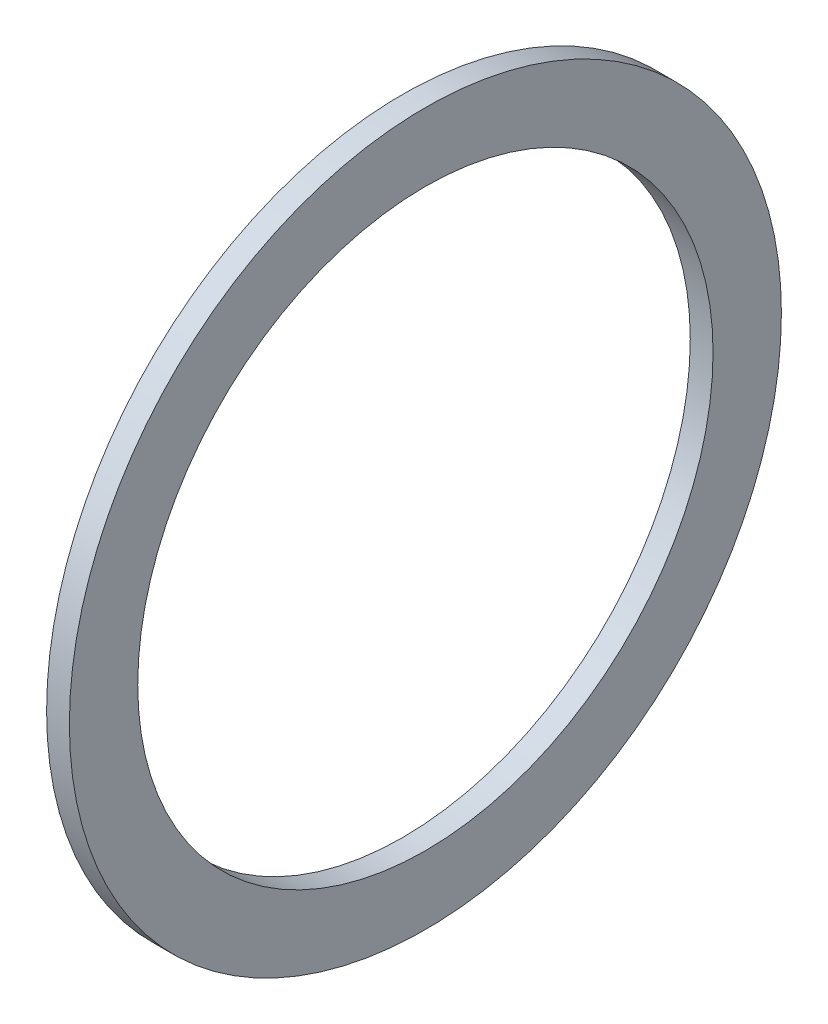
ISO-10303-21;
HEADER;
FILE_DESCRIPTION(('STEP AP214'),'2;1');
FILE_NAME('part.step','',(''),(''),'','','');
FILE_SCHEMA(('AUTOMOTIVE_DESIGN { 1 0 10303 214 1 1 1 1 }'));
ENDSEC;
DATA;
#1=APPLICATION_CONTEXT('core data for automotive mechanical design processes');
#2=APPLICATION_PROTOCOL_DEFINITION('international standard','automotive_design',2000,#1);
#3=PRODUCT_CONTEXT('',#1,'mechanical');
#4=PRODUCT('Part','Part','',(#3));
#5=PRODUCT_RELATED_PRODUCT_CATEGORY('part','',(#4));
#6=PRODUCT_DEFINITION_FORMATION('','',#4);
#7=PRODUCT_DEFINITION_CONTEXT('part definition',#1,'design');
#8=PRODUCT_DEFINITION('design','',#6,#7);
#9=PRODUCT_DEFINITION_SHAPE('','',#8);
#10=(LENGTH_UNIT() NAMED_UNIT(*) SI_UNIT(.MILLI.,.METRE.));
#11=(NAMED_UNIT(*) PLANE_ANGLE_UNIT() SI_UNIT($,.RADIAN.));
#12=(NAMED_UNIT(*) SI_UNIT($,.STERADIAN.) SOLID_ANGLE_UNIT());
#13=UNCERTAINTY_MEASURE_WITH_UNIT(LENGTH_MEASURE(1.E-05),#10,'distance_accuracy_value','');
#14=(GEOMETRIC_REPRESENTATION_CONTEXT(3) GLOBAL_UNCERTAINTY_ASSIGNED_CONTEXT((#13)) GLOBAL_UNIT_ASSIGNED_CONTEXT((#10,
#11,#12)) REPRESENTATION_CONTEXT('',''));
#15=CARTESIAN_POINT('',(0.,0.,0.));
#16=DIRECTION('',(0.,0.,1.));
#17=DIRECTION('',(1.,0.,0.));
#18=AXIS2_PLACEMENT_3D('',#15,#16,#17);
#19=CARTESIAN_POINT('',(16.7,25.003022,-0.005631764349996));
#20=DIRECTION('',(-1.,0.,0.));
#21=DIRECTION('',(0.,0.,1.));
#22=AXIS2_PLACEMENT_3D('',#19,#20,#21);
#23=PLANE('',#22);
#24=CARTESIAN_POINT('',(16.7,12.500022,-12.50863176435));
#25=DIRECTION('',(1.,0.,0.));
#26=DIRECTION('',(0.,0.,-1.));
#27=AXIS2_PLACEMENT_3D('',#24,#25,#26);
#28=CIRCLE('',#27,12.5);
#29=CARTESIAN_POINT('',(16.7,12.500022,-25.00863176435));
#30=VERTEX_POINT('',#29);
#31=EDGE_CURVE('E26',#30,#30,#28,.T.);
#32=ORIENTED_EDGE('',*,*,#31,.F.);
#33=EDGE_LOOP('',(#32));
#34=FACE_BOUND('',#33,.T.);
#35=CARTESIAN_POINT('',(16.7,12.500022,-12.50863176435));
#36=DIRECTION('',(1.,0.,0.));
#37=DIRECTION('',(0.,0.,-1.));
#38=AXIS2_PLACEMENT_3D('',#35,#36,#37);
#39=CIRCLE('',#38,10.1);
#40=CARTESIAN_POINT('',(16.7,12.500022,-22.60863176435));
#41=VERTEX_POINT('',#40);
#42=EDGE_CURVE('E17',#41,#41,#39,.T.);
#43=ORIENTED_EDGE('',*,*,#42,.T.);
#44=EDGE_LOOP('',(#43));
#45=FACE_BOUND('',#44,.T.);
#46=ADVANCED_FACE('F14',(#34,#45),#23,.T.);
#47=CARTESIAN_POINT('',(16.697,12.500022,-12.50863176435));
#48=DIRECTION('',(1.,0.,0.));
#49=DIRECTION('',(0.,0.,-1.));
#50=AXIS2_PLACEMENT_3D('',#47,#48,#49);
#51=CYLINDRICAL_SURFACE('',#50,10.1);
#52=CARTESIAN_POINT('',(17.5,12.500022,-12.50863176435));
#53=DIRECTION('',(1.,0.,0.));
#54=DIRECTION('',(0.,0.,-1.));
#55=AXIS2_PLACEMENT_3D('',#52,#53,#54);
#56=CIRCLE('',#55,10.1);
#57=CARTESIAN_POINT('',(17.5,12.500022,-22.60863176435));
#58=VERTEX_POINT('',#57);
#59=EDGE_CURVE('E21',#58,#58,#56,.F.);
#60=ORIENTED_EDGE('',*,*,#59,.F.);
#61=EDGE_LOOP('',(#60));
#62=FACE_BOUND('',#61,.T.);
#63=ORIENTED_EDGE('',*,*,#42,.F.);
#64=EDGE_LOOP('',(#63));
#65=FACE_BOUND('',#64,.T.);
#66=ADVANCED_FACE('F35',(#62,#65),#51,.F.);
#67=CARTESIAN_POINT('',(16.697,12.500022,-12.50863176435));
#68=DIRECTION('',(1.,0.,0.));
#69=DIRECTION('',(0.,0.,-1.));
#70=AXIS2_PLACEMENT_3D('',#67,#68,#69);
#71=CYLINDRICAL_SURFACE('',#70,12.5);
#72=CARTESIAN_POINT('',(17.5,12.500022,-12.50863176435));
#73=DIRECTION('',(1.,0.,0.));
#74=DIRECTION('',(0.,0.,-1.));
#75=AXIS2_PLACEMENT_3D('',#72,#73,#74);
#76=CIRCLE('',#75,12.5);
#77=CARTESIAN_POINT('',(17.5,12.500022,-25.00863176435));
#78=VERTEX_POINT('',#77);
#79=EDGE_CURVE('E10',#78,#78,#76,.T.);
#80=ORIENTED_EDGE('',*,*,#79,.F.);
#81=EDGE_LOOP('',(#80));
#82=FACE_BOUND('',#81,.T.);
#83=ORIENTED_EDGE('',*,*,#31,.T.);
#84=EDGE_LOOP('',(#83));
#85=FACE_BOUND('',#84,.T.);
#86=ADVANCED_FACE('F37',(#82,#85),#71,.T.);
#87=CARTESIAN_POINT('',(17.5,25.003022,-0.005631764349996));
#88=DIRECTION('',(1.,0.,0.));
#89=DIRECTION('',(0.,0.,-1.));
#90=AXIS2_PLACEMENT_3D('',#87,#88,#89);
#91=PLANE('',#90);
#92=ORIENTED_EDGE('',*,*,#79,.T.);
#93=EDGE_LOOP('',(#92));
#94=FACE_BOUND('',#93,.T.);
#95=ORIENTED_EDGE('',*,*,#59,.T.);
#96=EDGE_LOOP('',(#95));
#97=FACE_BOUND('',#96,.T.);
#98=ADVANCED_FACE('F44',(#94,#97),#91,.T.);
#99=CLOSED_SHELL('',(#46,#66,#86,#98));
#100=MANIFOLD_SOLID_BREP('B1',#99);
#101=ADVANCED_BREP_SHAPE_REPRESENTATION('',(#18,#100),#14);
#102=SHAPE_DEFINITION_REPRESENTATION(#9,#101);
ENDSEC;
END-ISO-10303-21;
